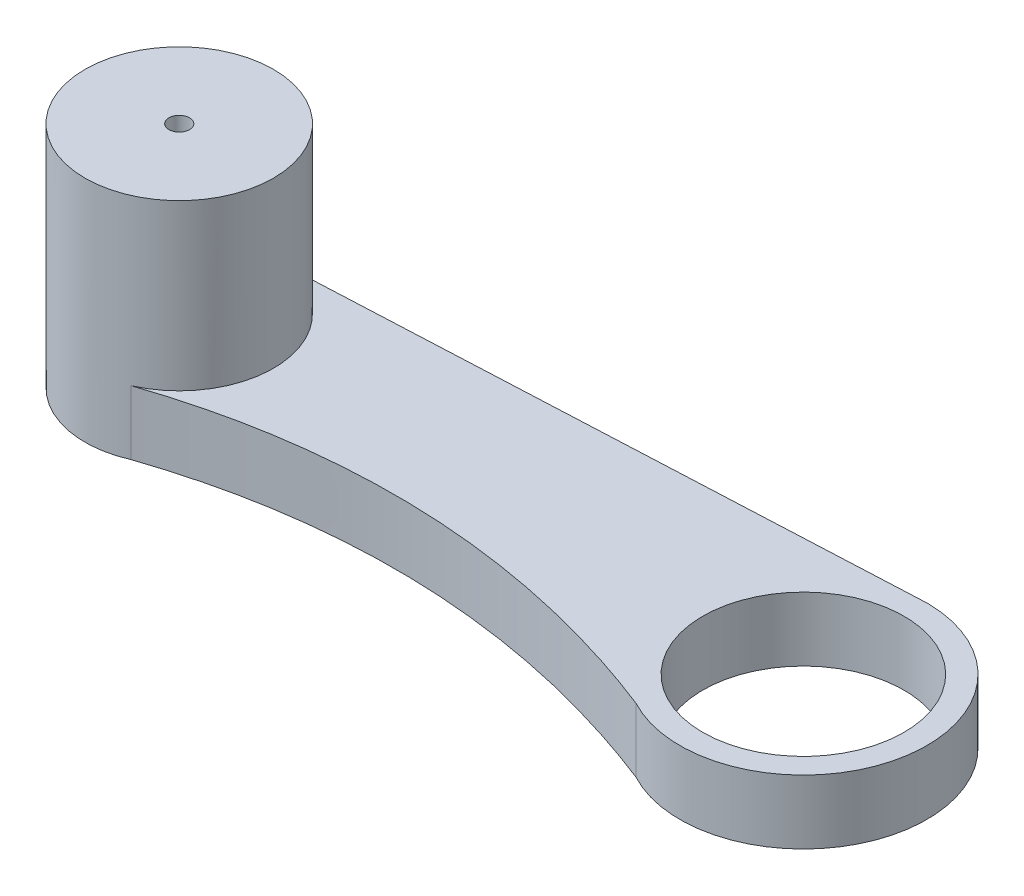
ISO-10303-21;
HEADER;
FILE_DESCRIPTION(('STEP AP214'),'2;1');
FILE_NAME('part.step','',(''),(''),'','','');
FILE_SCHEMA(('AUTOMOTIVE_DESIGN { 1 0 10303 214 1 1 1 1 }'));
ENDSEC;
DATA;
#1=APPLICATION_CONTEXT('core data for automotive mechanical design processes');
#2=APPLICATION_PROTOCOL_DEFINITION('international standard','automotive_design',2000,#1);
#3=PRODUCT_CONTEXT('',#1,'mechanical');
#4=PRODUCT('Part','Part','',(#3));
#5=PRODUCT_RELATED_PRODUCT_CATEGORY('part','',(#4));
#6=PRODUCT_DEFINITION_FORMATION('','',#4);
#7=PRODUCT_DEFINITION_CONTEXT('part definition',#1,'design');
#8=PRODUCT_DEFINITION('design','',#6,#7);
#9=PRODUCT_DEFINITION_SHAPE('','',#8);
#10=(LENGTH_UNIT() NAMED_UNIT(*) SI_UNIT(.MILLI.,.METRE.));
#11=(NAMED_UNIT(*) PLANE_ANGLE_UNIT() SI_UNIT($,.RADIAN.));
#12=(NAMED_UNIT(*) SI_UNIT($,.STERADIAN.) SOLID_ANGLE_UNIT());
#13=UNCERTAINTY_MEASURE_WITH_UNIT(LENGTH_MEASURE(1.E-05),#10,'distance_accuracy_value','');
#14=(GEOMETRIC_REPRESENTATION_CONTEXT(3) GLOBAL_UNCERTAINTY_ASSIGNED_CONTEXT((#13)) GLOBAL_UNIT_ASSIGNED_CONTEXT((#10,
#11,#12)) REPRESENTATION_CONTEXT('',''));
#15=CARTESIAN_POINT('',(0.,0.,0.));
#16=DIRECTION('',(0.,0.,1.));
#17=DIRECTION('',(1.,0.,0.));
#18=AXIS2_PLACEMENT_3D('',#15,#16,#17);
#19=CARTESIAN_POINT('',(0.,-25.,0.));
#20=DIRECTION('',(0.,1.,0.));
#21=DIRECTION('',(0.,0.,-1.));
#22=AXIS2_PLACEMENT_3D('',#19,#20,#21);
#23=CYLINDRICAL_SURFACE('',#22,10.3);
#24=CARTESIAN_POINT('',(0.,-18.,0.));
#25=DIRECTION('',(0.,-1.,0.));
#26=DIRECTION('',(0.,0.,-1.));
#27=AXIS2_PLACEMENT_3D('',#24,#25,#26);
#28=CIRCLE('',#27,10.3);
#29=CARTESIAN_POINT('',(0.,-18.,-10.3));
#30=VERTEX_POINT('',#29);
#31=CARTESIAN_POINT('',(4.16990453527767,-18.,9.41816840827721));
#32=VERTEX_POINT('',#31);
#33=EDGE_CURVE('E111',#30,#32,#28,.T.);
#34=ORIENTED_EDGE('',*,*,#33,.F.);
#35=DIRECTION('',(0.,-1.,0.));
#36=VECTOR('',#35,1.);
#37=CARTESIAN_POINT('',(0.,-18.,-10.3));
#38=LINE('',#37,#36);
#39=CARTESIAN_POINT('',(0.,-25.,-10.3));
#40=VERTEX_POINT('',#39);
#41=EDGE_CURVE('E104',#30,#40,#38,.T.);
#42=ORIENTED_EDGE('',*,*,#41,.T.);
#43=CARTESIAN_POINT('',(0.,-25.,0.));
#44=DIRECTION('',(0.,1.,0.));
#45=DIRECTION('',(0.,0.,1.));
#46=AXIS2_PLACEMENT_3D('',#43,#44,#45);
#47=CIRCLE('',#46,10.3);
#48=CARTESIAN_POINT('',(4.16990453527767,-25.,9.41816840827721));
#49=VERTEX_POINT('',#48);
#50=EDGE_CURVE('E11',#40,#49,#47,.T.);
#51=ORIENTED_EDGE('',*,*,#50,.T.);
#52=DIRECTION('',(0.,-1.,0.));
#53=VECTOR('',#52,1.);
#54=CARTESIAN_POINT('',(4.16990453527767,-18.,9.41816840827721));
#55=LINE('',#54,#53);
#56=EDGE_CURVE('E129',#32,#49,#55,.T.);
#57=ORIENTED_EDGE('',*,*,#56,.F.);
#58=EDGE_LOOP('',(#34,#42,#51,#57));
#59=FACE_BOUND('',#58,.T.);
#60=CARTESIAN_POINT('',(0.,0.,0.));
#61=DIRECTION('',(0.,1.,0.));
#62=DIRECTION('',(0.,0.,1.));
#63=AXIS2_PLACEMENT_3D('',#60,#61,#62);
#64=CIRCLE('',#63,10.3);
#65=CARTESIAN_POINT('',(0.,0.,10.3));
#66=VERTEX_POINT('',#65);
#67=EDGE_CURVE('E47',#66,#66,#64,.T.);
#68=ORIENTED_EDGE('',*,*,#67,.F.);
#69=EDGE_LOOP('',(#68));
#70=FACE_BOUND('',#69,.T.);
#71=ADVANCED_FACE('F44',(#59,#70),#23,.T.);
#72=CARTESIAN_POINT('',(0.,-25.,0.));
#73=DIRECTION('',(0.,-1.,0.));
#74=DIRECTION('',(0.,0.,1.));
#75=AXIS2_PLACEMENT_3D('',#72,#73,#74);
#76=PLANE('',#75);
#77=CARTESIAN_POINT('',(68.2073015610216,-25.,0.));
#78=DIRECTION('',(0.,1.,0.));
#79=DIRECTION('',(0.,0.,1.));
#80=AXIS2_PLACEMENT_3D('',#77,#78,#79);
#81=CIRCLE('',#80,11.);
#82=CARTESIAN_POINT('',(68.2073015610216,-25.,11.));
#83=VERTEX_POINT('',#82);
#84=EDGE_CURVE('E181',#83,#83,#81,.T.);
#85=ORIENTED_EDGE('',*,*,#84,.T.);
#86=EDGE_LOOP('',(#85));
#87=FACE_BOUND('',#86,.T.);
#88=CARTESIAN_POINT('',(0.,-25.,0.));
#89=DIRECTION('',(0.,-1.,0.));
#90=DIRECTION('',(0.,0.,-1.));
#91=AXIS2_PLACEMENT_3D('',#88,#89,#90);
#92=CIRCLE('',#91,1.12499999999999);
#93=CARTESIAN_POINT('',(0.,-25.,-1.12499999999999));
#94=VERTEX_POINT('',#93);
#95=EDGE_CURVE('E140',#94,#94,#92,.T.);
#96=ORIENTED_EDGE('',*,*,#95,.F.);
#97=EDGE_LOOP('',(#96));
#98=FACE_BOUND('',#97,.T.);
#99=ORIENTED_EDGE('',*,*,#50,.F.);
#100=DIRECTION('',(-0.998901267413146,0.,0.0468642503451384));
#101=VECTOR('',#100,1.);
#102=CARTESIAN_POINT('',(66.9433570662362,-25.,-13.4407010350689));
#103=LINE('',#102,#101);
#104=CARTESIAN_POINT('',(66.9433570662362,-25.,-13.4407010350689));
#105=VERTEX_POINT('',#104);
#106=EDGE_CURVE('E59',#105,#40,#103,.T.);
#107=ORIENTED_EDGE('',*,*,#106,.F.);
#108=CARTESIAN_POINT('',(68.2073015610216,-25.,0.));
#109=DIRECTION('',(0.,1.,0.));
#110=DIRECTION('',(0.,0.,1.));
#111=AXIS2_PLACEMENT_3D('',#108,#109,#110);
#112=CIRCLE('',#111,13.5);
#113=CARTESIAN_POINT('',(61.8200064973479,-25.,11.8933789046499));
#114=VERTEX_POINT('',#113);
#115=EDGE_CURVE('E102',#114,#105,#112,.T.);
#116=ORIENTED_EDGE('',*,*,#115,.F.);
#117=CARTESIAN_POINT('',(4.16990453527767,-25.,9.41816840827721));
#118=CARTESIAN_POINT('',(22.46177603715,-25.,3.24596138026616));
#119=CARTESIAN_POINT('',(41.93415181531,-25.,4.07724305719363));
#120=CARTESIAN_POINT('',(61.8200064973479,-25.,11.8933789046499));
#121=B_SPLINE_CURVE_WITH_KNOTS('',3,(#117,#118,#119,#120),.UNSPECIFIED.,.F.,.F.,(4,4),(0.,1.),.UNSPECIFIED.);
#122=EDGE_CURVE('E85',#49,#114,#121,.T.);
#123=ORIENTED_EDGE('',*,*,#122,.F.);
#124=EDGE_LOOP('',(#99,#107,#116,#123));
#125=FACE_BOUND('',#124,.T.);
#126=ADVANCED_FACE('F152',(#87,#98,#125),#76,.T.);
#127=CARTESIAN_POINT('',(0.,0.,0.));
#128=DIRECTION('',(0.,-1.,0.));
#129=DIRECTION('',(0.,0.,1.));
#130=AXIS2_PLACEMENT_3D('',#127,#128,#129);
#131=PLANE('',#130);
#132=CARTESIAN_POINT('',(0.,0.,0.));
#133=DIRECTION('',(0.,-1.,0.));
#134=DIRECTION('',(0.,0.,-1.));
#135=AXIS2_PLACEMENT_3D('',#132,#133,#134);
#136=CIRCLE('',#135,1.125);
#137=CARTESIAN_POINT('',(0.,0.,-1.125));
#138=VERTEX_POINT('',#137);
#139=EDGE_CURVE('E132',#138,#138,#136,.T.);
#140=ORIENTED_EDGE('',*,*,#139,.T.);
#141=EDGE_LOOP('',(#140));
#142=FACE_BOUND('',#141,.T.);
#143=ORIENTED_EDGE('',*,*,#67,.T.);
#144=EDGE_LOOP('',(#143));
#145=FACE_BOUND('',#144,.T.);
#146=ADVANCED_FACE('F149',(#142,#145),#131,.F.);
#147=CARTESIAN_POINT('',(0.,0.,0.));
#148=DIRECTION('',(0.,1.,0.));
#149=DIRECTION('',(0.,0.,-1.));
#150=AXIS2_PLACEMENT_3D('',#147,#148,#149);
#151=CYLINDRICAL_SURFACE('',#150,1.125);
#152=ORIENTED_EDGE('',*,*,#95,.T.);
#153=EDGE_LOOP('',(#152));
#154=FACE_BOUND('',#153,.T.);
#155=ORIENTED_EDGE('',*,*,#139,.F.);
#156=EDGE_LOOP('',(#155));
#157=FACE_BOUND('',#156,.T.);
#158=ADVANCED_FACE('F161',(#154,#157),#151,.F.);
#159=CARTESIAN_POINT('',(4.16990453527767,-18.,9.41816840827721));
#160=CARTESIAN_POINT('',(22.46177603715,-18.,3.24596138026616));
#161=CARTESIAN_POINT('',(41.93415181531,-18.,4.07724305719363));
#162=CARTESIAN_POINT('',(61.8200064973479,-18.,11.8933789046499));
#163=B_SPLINE_CURVE_WITH_KNOTS('',3,(#159,#160,#161,#162),.UNSPECIFIED.,.F.,.F.,(4,4),(0.,1.),.UNSPECIFIED.);
#164=DIRECTION('',(0.,-1.,0.));
#165=VECTOR('',#164,1.);
#166=SURFACE_OF_LINEAR_EXTRUSION('',#163,#165);
#167=ORIENTED_EDGE('',*,*,#122,.T.);
#168=DIRECTION('',(0.,-1.,0.));
#169=VECTOR('',#168,1.);
#170=CARTESIAN_POINT('',(61.8200064973479,-18.,11.8933789046499));
#171=LINE('',#170,#169);
#172=CARTESIAN_POINT('',(61.8200064973479,-18.,11.8933789046499));
#173=VERTEX_POINT('',#172);
#174=EDGE_CURVE('E105',#173,#114,#171,.T.);
#175=ORIENTED_EDGE('',*,*,#174,.F.);
#176=EDGE_CURVE('E68',#32,#173,#163,.T.);
#177=ORIENTED_EDGE('',*,*,#176,.F.);
#178=ORIENTED_EDGE('',*,*,#56,.T.);
#179=EDGE_LOOP('',(#167,#175,#177,#178));
#180=FACE_BOUND('',#179,.T.);
#181=ADVANCED_FACE('F159',(#180),#166,.F.);
#182=CARTESIAN_POINT('',(66.9433570662362,-18.,-13.4407010350689));
#183=DIRECTION('',(-0.0468642503451384,0.,-0.998901267413145));
#184=DIRECTION('',(-0.998901267413146,0.,0.0468642503451384));
#185=AXIS2_PLACEMENT_3D('',#182,#183,#184);
#186=PLANE('',#185);
#187=ORIENTED_EDGE('',*,*,#106,.T.);
#188=ORIENTED_EDGE('',*,*,#41,.F.);
#189=DIRECTION('',(-0.998901267413146,0.,0.0468642503451384));
#190=VECTOR('',#189,1.);
#191=CARTESIAN_POINT('',(66.9433570662362,-18.,-13.4407010350689));
#192=LINE('',#191,#190);
#193=CARTESIAN_POINT('',(66.9433570662362,-18.,-13.4407010350689));
#194=VERTEX_POINT('',#193);
#195=EDGE_CURVE('E96',#194,#30,#192,.T.);
#196=ORIENTED_EDGE('',*,*,#195,.F.);
#197=DIRECTION('',(0.,-1.,0.));
#198=VECTOR('',#197,1.);
#199=CARTESIAN_POINT('',(66.9433570662362,-18.,-13.4407010350689));
#200=LINE('',#199,#198);
#201=EDGE_CURVE('E100',#194,#105,#200,.T.);
#202=ORIENTED_EDGE('',*,*,#201,.T.);
#203=EDGE_LOOP('',(#187,#188,#196,#202));
#204=FACE_BOUND('',#203,.T.);
#205=ADVANCED_FACE('F107',(#204),#186,.T.);
#206=CARTESIAN_POINT('',(68.2073015610216,-18.,0.));
#207=DIRECTION('',(0.,-1.,0.));
#208=DIRECTION('',(0.,0.,1.));
#209=AXIS2_PLACEMENT_3D('',#206,#207,#208);
#210=CYLINDRICAL_SURFACE('',#209,13.5);
#211=ORIENTED_EDGE('',*,*,#115,.T.);
#212=ORIENTED_EDGE('',*,*,#201,.F.);
#213=CARTESIAN_POINT('',(68.2073015610216,-18.,0.));
#214=DIRECTION('',(0.,1.,0.));
#215=DIRECTION('',(0.,0.,1.));
#216=AXIS2_PLACEMENT_3D('',#213,#214,#215);
#217=CIRCLE('',#216,13.5);
#218=EDGE_CURVE('E91',#173,#194,#217,.T.);
#219=ORIENTED_EDGE('',*,*,#218,.F.);
#220=ORIENTED_EDGE('',*,*,#174,.T.);
#221=EDGE_LOOP('',(#211,#212,#219,#220));
#222=FACE_BOUND('',#221,.T.);
#223=ADVANCED_FACE('F101',(#222),#210,.T.);
#224=CARTESIAN_POINT('',(32.3972118237507,-18.,5.41014507816331));
#225=DIRECTION('',(0.,-1.,0.));
#226=DIRECTION('',(0.,0.,1.));
#227=AXIS2_PLACEMENT_3D('',#224,#225,#226);
#228=PLANE('',#227);
#229=CARTESIAN_POINT('',(68.2073015610216,-18.,0.));
#230=DIRECTION('',(0.,1.,0.));
#231=DIRECTION('',(0.,0.,1.));
#232=AXIS2_PLACEMENT_3D('',#229,#230,#231);
#233=CIRCLE('',#232,11.);
#234=CARTESIAN_POINT('',(68.2073015610216,-18.,11.));
#235=VERTEX_POINT('',#234);
#236=EDGE_CURVE('E121',#235,#235,#233,.T.);
#237=ORIENTED_EDGE('',*,*,#236,.F.);
#238=EDGE_LOOP('',(#237));
#239=FACE_BOUND('',#238,.T.);
#240=ORIENTED_EDGE('',*,*,#176,.T.);
#241=ORIENTED_EDGE('',*,*,#218,.T.);
#242=ORIENTED_EDGE('',*,*,#195,.T.);
#243=ORIENTED_EDGE('',*,*,#33,.T.);
#244=EDGE_LOOP('',(#240,#241,#242,#243));
#245=FACE_BOUND('',#244,.T.);
#246=ADVANCED_FACE('F93',(#239,#245),#228,.F.);
#247=CARTESIAN_POINT('',(68.2073015610216,-25.,0.));
#248=DIRECTION('',(0.,-1.,0.));
#249=DIRECTION('',(0.,0.,1.));
#250=AXIS2_PLACEMENT_3D('',#247,#248,#249);
#251=CYLINDRICAL_SURFACE('',#250,11.);
#252=ORIENTED_EDGE('',*,*,#84,.F.);
#253=EDGE_LOOP('',(#252));
#254=FACE_BOUND('',#253,.T.);
#255=ORIENTED_EDGE('',*,*,#236,.T.);
#256=EDGE_LOOP('',(#255));
#257=FACE_BOUND('',#256,.T.);
#258=ADVANCED_FACE('F187',(#254,#257),#251,.F.);
#259=CLOSED_SHELL('',(#71,#126,#146,#158,#181,#205,#223,#246,#258));
#260=MANIFOLD_SOLID_BREP('B2',#259);
#261=ADVANCED_BREP_SHAPE_REPRESENTATION('',(#18,#260),#14);
#262=SHAPE_DEFINITION_REPRESENTATION(#9,#261);
ENDSEC;
END-ISO-10303-21;
